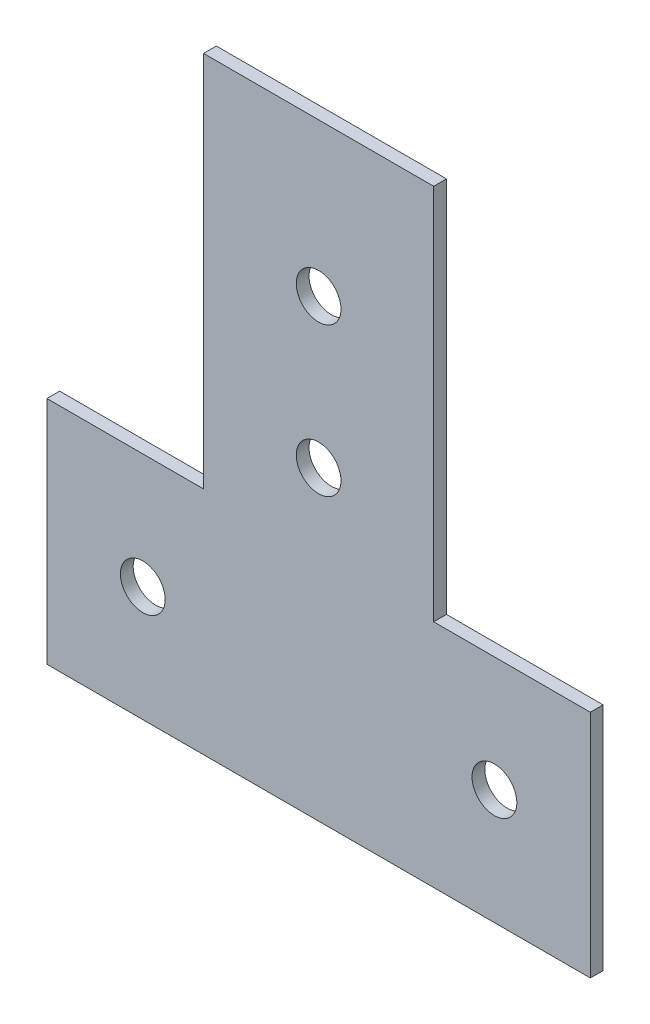
ISO-10303-21;
HEADER;
FILE_DESCRIPTION(('STEP AP214'),'2;1');
FILE_NAME('part.step','',(''),(''),'','','');
FILE_SCHEMA(('AUTOMOTIVE_DESIGN { 1 0 10303 214 1 1 1 1 }'));
ENDSEC;
DATA;
#1=APPLICATION_CONTEXT('core data for automotive mechanical design processes');
#2=APPLICATION_PROTOCOL_DEFINITION('international standard','automotive_design',2000,#1);
#3=PRODUCT_CONTEXT('',#1,'mechanical');
#4=PRODUCT('Part','Part','',(#3));
#5=PRODUCT_RELATED_PRODUCT_CATEGORY('part','',(#4));
#6=PRODUCT_DEFINITION_FORMATION('','',#4);
#7=PRODUCT_DEFINITION_CONTEXT('part definition',#1,'design');
#8=PRODUCT_DEFINITION('design','',#6,#7);
#9=PRODUCT_DEFINITION_SHAPE('','',#8);
#10=(LENGTH_UNIT() NAMED_UNIT(*) SI_UNIT(.MILLI.,.METRE.));
#11=(NAMED_UNIT(*) PLANE_ANGLE_UNIT() SI_UNIT($,.RADIAN.));
#12=(NAMED_UNIT(*) SI_UNIT($,.STERADIAN.) SOLID_ANGLE_UNIT());
#13=UNCERTAINTY_MEASURE_WITH_UNIT(LENGTH_MEASURE(1.E-05),#10,'distance_accuracy_value','');
#14=(GEOMETRIC_REPRESENTATION_CONTEXT(3) GLOBAL_UNCERTAINTY_ASSIGNED_CONTEXT((#13)) GLOBAL_UNIT_ASSIGNED_CONTEXT((#10,
#11,#12)) REPRESENTATION_CONTEXT('',''));
#15=CARTESIAN_POINT('',(0.,0.,0.));
#16=DIRECTION('',(0.,0.,1.));
#17=DIRECTION('',(1.,0.,0.));
#18=AXIS2_PLACEMENT_3D('',#15,#16,#17);
#19=CARTESIAN_POINT('',(18.,18.,2.));
#20=DIRECTION('',(0.,-1.,0.));
#21=DIRECTION('',(0.,0.,-1.));
#22=AXIS2_PLACEMENT_3D('',#19,#20,#21);
#23=PLANE('',#22);
#24=DIRECTION('',(-1.,0.,0.));
#25=VECTOR('',#24,1.);
#26=CARTESIAN_POINT('',(18.,18.,0.));
#27=LINE('',#26,#25);
#28=CARTESIAN_POINT('',(42.5,18.,0.));
#29=VERTEX_POINT('',#28);
#30=CARTESIAN_POINT('',(18.,18.,0.));
#31=VERTEX_POINT('',#30);
#32=EDGE_CURVE('E127',#29,#31,#27,.T.);
#33=ORIENTED_EDGE('',*,*,#32,.T.);
#34=DIRECTION('',(0.,0.,-1.));
#35=VECTOR('',#34,1.);
#36=CARTESIAN_POINT('',(18.,18.,2.));
#37=LINE('',#36,#35);
#38=CARTESIAN_POINT('',(18.,18.,2.));
#39=VERTEX_POINT('',#38);
#40=EDGE_CURVE('E11',#39,#31,#37,.T.);
#41=ORIENTED_EDGE('',*,*,#40,.F.);
#42=DIRECTION('',(-1.,0.,0.));
#43=VECTOR('',#42,1.);
#44=CARTESIAN_POINT('',(18.,18.,2.));
#45=LINE('',#44,#43);
#46=CARTESIAN_POINT('',(42.5,18.,2.));
#47=VERTEX_POINT('',#46);
#48=EDGE_CURVE('E142',#47,#39,#45,.T.);
#49=ORIENTED_EDGE('',*,*,#48,.F.);
#50=DIRECTION('',(0.,0.,-1.));
#51=VECTOR('',#50,1.);
#52=CARTESIAN_POINT('',(42.5,18.,2.));
#53=LINE('',#52,#51);
#54=EDGE_CURVE('E123',#47,#29,#53,.T.);
#55=ORIENTED_EDGE('',*,*,#54,.T.);
#56=EDGE_LOOP('',(#33,#41,#49,#55));
#57=FACE_BOUND('',#56,.T.);
#58=ADVANCED_FACE('F31',(#57),#23,.F.);
#59=CARTESIAN_POINT('',(18.,18.,2.));
#60=DIRECTION('',(-1.,0.,0.));
#61=DIRECTION('',(0.,0.,1.));
#62=AXIS2_PLACEMENT_3D('',#59,#60,#61);
#63=PLANE('',#62);
#64=DIRECTION('',(0.,1.,0.));
#65=VECTOR('',#64,1.);
#66=CARTESIAN_POINT('',(18.,18.,0.));
#67=LINE('',#66,#65);
#68=CARTESIAN_POINT('',(18.,77.,0.));
#69=VERTEX_POINT('',#68);
#70=EDGE_CURVE('E130',#31,#69,#67,.T.);
#71=ORIENTED_EDGE('',*,*,#70,.T.);
#72=DIRECTION('',(0.,0.,-1.));
#73=VECTOR('',#72,1.);
#74=CARTESIAN_POINT('',(18.,77.,2.));
#75=LINE('',#74,#73);
#76=CARTESIAN_POINT('',(18.,77.,2.));
#77=VERTEX_POINT('',#76);
#78=EDGE_CURVE('E39',#77,#69,#75,.T.);
#79=ORIENTED_EDGE('',*,*,#78,.F.);
#80=DIRECTION('',(0.,1.,0.));
#81=VECTOR('',#80,1.);
#82=CARTESIAN_POINT('',(18.,18.,2.));
#83=LINE('',#82,#81);
#84=EDGE_CURVE('E90',#39,#77,#83,.T.);
#85=ORIENTED_EDGE('',*,*,#84,.F.);
#86=ORIENTED_EDGE('',*,*,#40,.T.);
#87=EDGE_LOOP('',(#71,#79,#85,#86));
#88=FACE_BOUND('',#87,.T.);
#89=ADVANCED_FACE('F232',(#88),#63,.F.);
#90=CARTESIAN_POINT('',(-18.,77.,2.));
#91=DIRECTION('',(0.,-1.,0.));
#92=DIRECTION('',(0.,0.,-1.));
#93=AXIS2_PLACEMENT_3D('',#90,#91,#92);
#94=PLANE('',#93);
#95=DIRECTION('',(-1.,0.,0.));
#96=VECTOR('',#95,1.);
#97=CARTESIAN_POINT('',(-18.,77.,0.));
#98=LINE('',#97,#96);
#99=CARTESIAN_POINT('',(-18.,77.,0.));
#100=VERTEX_POINT('',#99);
#101=EDGE_CURVE('E133',#69,#100,#98,.T.);
#102=ORIENTED_EDGE('',*,*,#101,.T.);
#103=DIRECTION('',(0.,0.,-1.));
#104=VECTOR('',#103,1.);
#105=CARTESIAN_POINT('',(-18.,77.,2.));
#106=LINE('',#105,#104);
#107=CARTESIAN_POINT('',(-18.,77.,2.));
#108=VERTEX_POINT('',#107);
#109=EDGE_CURVE('E149',#108,#100,#106,.T.);
#110=ORIENTED_EDGE('',*,*,#109,.F.);
#111=DIRECTION('',(-1.,0.,0.));
#112=VECTOR('',#111,1.);
#113=CARTESIAN_POINT('',(-18.,77.,2.));
#114=LINE('',#113,#112);
#115=EDGE_CURVE('E157',#77,#108,#114,.T.);
#116=ORIENTED_EDGE('',*,*,#115,.F.);
#117=ORIENTED_EDGE('',*,*,#78,.T.);
#118=EDGE_LOOP('',(#102,#110,#116,#117));
#119=FACE_BOUND('',#118,.T.);
#120=ADVANCED_FACE('F155',(#119),#94,.F.);
#121=CARTESIAN_POINT('',(-18.,18.,2.));
#122=DIRECTION('',(1.,0.,0.));
#123=DIRECTION('',(0.,0.,-1.));
#124=AXIS2_PLACEMENT_3D('',#121,#122,#123);
#125=PLANE('',#124);
#126=DIRECTION('',(0.,-1.,0.));
#127=VECTOR('',#126,1.);
#128=CARTESIAN_POINT('',(-18.,18.,0.));
#129=LINE('',#128,#127);
#130=CARTESIAN_POINT('',(-18.,18.,0.));
#131=VERTEX_POINT('',#130);
#132=EDGE_CURVE('E135',#100,#131,#129,.T.);
#133=ORIENTED_EDGE('',*,*,#132,.T.);
#134=DIRECTION('',(0.,0.,-1.));
#135=VECTOR('',#134,1.);
#136=CARTESIAN_POINT('',(-18.,18.,2.));
#137=LINE('',#136,#135);
#138=CARTESIAN_POINT('',(-18.,18.,2.));
#139=VERTEX_POINT('',#138);
#140=EDGE_CURVE('E146',#139,#131,#137,.T.);
#141=ORIENTED_EDGE('',*,*,#140,.F.);
#142=DIRECTION('',(0.,-1.,0.));
#143=VECTOR('',#142,1.);
#144=CARTESIAN_POINT('',(-18.,18.,2.));
#145=LINE('',#144,#143);
#146=EDGE_CURVE('E169',#108,#139,#145,.T.);
#147=ORIENTED_EDGE('',*,*,#146,.F.);
#148=ORIENTED_EDGE('',*,*,#109,.T.);
#149=EDGE_LOOP('',(#133,#141,#147,#148));
#150=FACE_BOUND('',#149,.T.);
#151=ADVANCED_FACE('F165',(#150),#125,.F.);
#152=CARTESIAN_POINT('',(-42.5,18.,2.));
#153=DIRECTION('',(0.,-1.,0.));
#154=DIRECTION('',(0.,0.,-1.));
#155=AXIS2_PLACEMENT_3D('',#152,#153,#154);
#156=PLANE('',#155);
#157=DIRECTION('',(-1.,0.,0.));
#158=VECTOR('',#157,1.);
#159=CARTESIAN_POINT('',(-42.5,18.,0.));
#160=LINE('',#159,#158);
#161=CARTESIAN_POINT('',(-42.5,18.,0.));
#162=VERTEX_POINT('',#161);
#163=EDGE_CURVE('E137',#131,#162,#160,.T.);
#164=ORIENTED_EDGE('',*,*,#163,.T.);
#165=DIRECTION('',(0.,0.,-1.));
#166=VECTOR('',#165,1.);
#167=CARTESIAN_POINT('',(-42.5,18.,2.));
#168=LINE('',#167,#166);
#169=CARTESIAN_POINT('',(-42.5,18.,2.));
#170=VERTEX_POINT('',#169);
#171=EDGE_CURVE('E118',#170,#162,#168,.T.);
#172=ORIENTED_EDGE('',*,*,#171,.F.);
#173=DIRECTION('',(-1.,0.,0.));
#174=VECTOR('',#173,1.);
#175=CARTESIAN_POINT('',(-42.5,18.,2.));
#176=LINE('',#175,#174);
#177=EDGE_CURVE('E109',#139,#170,#176,.T.);
#178=ORIENTED_EDGE('',*,*,#177,.F.);
#179=ORIENTED_EDGE('',*,*,#140,.T.);
#180=EDGE_LOOP('',(#164,#172,#178,#179));
#181=FACE_BOUND('',#180,.T.);
#182=ADVANCED_FACE('F168',(#181),#156,.F.);
#183=CARTESIAN_POINT('',(-42.5,-18.,2.));
#184=DIRECTION('',(1.,0.,0.));
#185=DIRECTION('',(0.,0.,-1.));
#186=AXIS2_PLACEMENT_3D('',#183,#184,#185);
#187=PLANE('',#186);
#188=DIRECTION('',(0.,-1.,0.));
#189=VECTOR('',#188,1.);
#190=CARTESIAN_POINT('',(-42.5,-18.,0.));
#191=LINE('',#190,#189);
#192=CARTESIAN_POINT('',(-42.5,-18.,0.));
#193=VERTEX_POINT('',#192);
#194=EDGE_CURVE('E117',#162,#193,#191,.T.);
#195=ORIENTED_EDGE('',*,*,#194,.T.);
#196=DIRECTION('',(0.,0.,-1.));
#197=VECTOR('',#196,1.);
#198=CARTESIAN_POINT('',(-42.5,-18.,2.));
#199=LINE('',#198,#197);
#200=CARTESIAN_POINT('',(-42.5,-18.,2.));
#201=VERTEX_POINT('',#200);
#202=EDGE_CURVE('E114',#201,#193,#199,.T.);
#203=ORIENTED_EDGE('',*,*,#202,.F.);
#204=DIRECTION('',(0.,-1.,0.));
#205=VECTOR('',#204,1.);
#206=CARTESIAN_POINT('',(-42.5,-18.,2.));
#207=LINE('',#206,#205);
#208=EDGE_CURVE('E103',#170,#201,#207,.T.);
#209=ORIENTED_EDGE('',*,*,#208,.F.);
#210=ORIENTED_EDGE('',*,*,#171,.T.);
#211=EDGE_LOOP('',(#195,#203,#209,#210));
#212=FACE_BOUND('',#211,.T.);
#213=ADVANCED_FACE('F115',(#212),#187,.F.);
#214=CARTESIAN_POINT('',(-42.5,-18.,2.));
#215=DIRECTION('',(0.,1.,0.));
#216=DIRECTION('',(0.,0.,1.));
#217=AXIS2_PLACEMENT_3D('',#214,#215,#216);
#218=PLANE('',#217);
#219=DIRECTION('',(1.,0.,0.));
#220=VECTOR('',#219,1.);
#221=CARTESIAN_POINT('',(-42.5,-18.,0.));
#222=LINE('',#221,#220);
#223=CARTESIAN_POINT('',(42.5,-18.,0.));
#224=VERTEX_POINT('',#223);
#225=EDGE_CURVE('E76',#193,#224,#222,.T.);
#226=ORIENTED_EDGE('',*,*,#225,.T.);
#227=DIRECTION('',(0.,0.,-1.));
#228=VECTOR('',#227,1.);
#229=CARTESIAN_POINT('',(42.5,-18.,2.));
#230=LINE('',#229,#228);
#231=CARTESIAN_POINT('',(42.5,-18.,2.));
#232=VERTEX_POINT('',#231);
#233=EDGE_CURVE('E119',#232,#224,#230,.T.);
#234=ORIENTED_EDGE('',*,*,#233,.F.);
#235=DIRECTION('',(1.,0.,0.));
#236=VECTOR('',#235,1.);
#237=CARTESIAN_POINT('',(-42.5,-18.,2.));
#238=LINE('',#237,#236);
#239=EDGE_CURVE('E107',#201,#232,#238,.T.);
#240=ORIENTED_EDGE('',*,*,#239,.F.);
#241=ORIENTED_EDGE('',*,*,#202,.T.);
#242=EDGE_LOOP('',(#226,#234,#240,#241));
#243=FACE_BOUND('',#242,.T.);
#244=ADVANCED_FACE('F121',(#243),#218,.F.);
#245=CARTESIAN_POINT('',(42.5,-18.,2.));
#246=DIRECTION('',(-1.,0.,0.));
#247=DIRECTION('',(0.,0.,1.));
#248=AXIS2_PLACEMENT_3D('',#245,#246,#247);
#249=PLANE('',#248);
#250=DIRECTION('',(0.,1.,0.));
#251=VECTOR('',#250,1.);
#252=CARTESIAN_POINT('',(42.5,-18.,0.));
#253=LINE('',#252,#251);
#254=EDGE_CURVE('E82',#224,#29,#253,.T.);
#255=ORIENTED_EDGE('',*,*,#254,.T.);
#256=ORIENTED_EDGE('',*,*,#54,.F.);
#257=DIRECTION('',(0.,1.,0.));
#258=VECTOR('',#257,1.);
#259=CARTESIAN_POINT('',(42.5,-18.,2.));
#260=LINE('',#259,#258);
#261=EDGE_CURVE('E47',#232,#47,#260,.T.);
#262=ORIENTED_EDGE('',*,*,#261,.F.);
#263=ORIENTED_EDGE('',*,*,#233,.T.);
#264=EDGE_LOOP('',(#255,#256,#262,#263));
#265=FACE_BOUND('',#264,.T.);
#266=ADVANCED_FACE('F210',(#265),#249,.F.);
#267=CARTESIAN_POINT('',(42.5,18.,2.));
#268=DIRECTION('',(0.,0.,1.));
#269=DIRECTION('',(1.,0.,0.));
#270=AXIS2_PLACEMENT_3D('',#267,#268,#269);
#271=PLANE('',#270);
#272=CARTESIAN_POINT('',(27.5,0.,2.));
#273=DIRECTION('',(0.,0.,1.));
#274=DIRECTION('',(-1.,0.,0.));
#275=AXIS2_PLACEMENT_3D('',#272,#273,#274);
#276=CIRCLE('',#275,3.5);
#277=CARTESIAN_POINT('',(24.,0.,2.));
#278=VERTEX_POINT('',#277);
#279=EDGE_CURVE('E193',#278,#278,#276,.T.);
#280=ORIENTED_EDGE('',*,*,#279,.F.);
#281=EDGE_LOOP('',(#280));
#282=FACE_BOUND('',#281,.T.);
#283=CARTESIAN_POINT('',(-27.5,0.,2.));
#284=DIRECTION('',(0.,0.,1.));
#285=DIRECTION('',(1.,0.,0.));
#286=AXIS2_PLACEMENT_3D('',#283,#284,#285);
#287=CIRCLE('',#286,3.5);
#288=CARTESIAN_POINT('',(-24.,0.,2.));
#289=VERTEX_POINT('',#288);
#290=EDGE_CURVE('E187',#289,#289,#287,.T.);
#291=ORIENTED_EDGE('',*,*,#290,.F.);
#292=EDGE_LOOP('',(#291));
#293=FACE_BOUND('',#292,.T.);
#294=CARTESIAN_POINT('',(0.,29.8521829483193,2.));
#295=DIRECTION('',(0.,0.,1.));
#296=DIRECTION('',(1.,0.,0.));
#297=AXIS2_PLACEMENT_3D('',#294,#295,#296);
#298=CIRCLE('',#297,3.5);
#299=CARTESIAN_POINT('',(3.5,29.8521829483193,2.));
#300=VERTEX_POINT('',#299);
#301=EDGE_CURVE('E181',#300,#300,#298,.T.);
#302=ORIENTED_EDGE('',*,*,#301,.F.);
#303=EDGE_LOOP('',(#302));
#304=FACE_BOUND('',#303,.T.);
#305=CARTESIAN_POINT('',(0.,53.0962575373912,2.));
#306=DIRECTION('',(0.,0.,1.));
#307=DIRECTION('',(1.,0.,0.));
#308=AXIS2_PLACEMENT_3D('',#305,#306,#307);
#309=CIRCLE('',#308,3.5);
#310=CARTESIAN_POINT('',(3.5,53.0962575373912,2.));
#311=VERTEX_POINT('',#310);
#312=EDGE_CURVE('E175',#311,#311,#309,.T.);
#313=ORIENTED_EDGE('',*,*,#312,.F.);
#314=EDGE_LOOP('',(#313));
#315=FACE_BOUND('',#314,.T.);
#316=ORIENTED_EDGE('',*,*,#48,.T.);
#317=ORIENTED_EDGE('',*,*,#84,.T.);
#318=ORIENTED_EDGE('',*,*,#115,.T.);
#319=ORIENTED_EDGE('',*,*,#146,.T.);
#320=ORIENTED_EDGE('',*,*,#177,.T.);
#321=ORIENTED_EDGE('',*,*,#208,.T.);
#322=ORIENTED_EDGE('',*,*,#239,.T.);
#323=ORIENTED_EDGE('',*,*,#261,.T.);
#324=EDGE_LOOP('',(#316,#317,#318,#319,#320,#321,#322,#323));
#325=FACE_BOUND('',#324,.T.);
#326=ADVANCED_FACE('F105',(#282,#293,#304,#315,#325),#271,.T.);
#327=CARTESIAN_POINT('',(42.5,18.,0.));
#328=DIRECTION('',(0.,0.,1.));
#329=DIRECTION('',(1.,0.,0.));
#330=AXIS2_PLACEMENT_3D('',#327,#328,#329);
#331=PLANE('',#330);
#332=CARTESIAN_POINT('',(27.5,0.,0.));
#333=DIRECTION('',(0.,0.,1.));
#334=DIRECTION('',(-1.,0.,0.));
#335=AXIS2_PLACEMENT_3D('',#332,#333,#334);
#336=CIRCLE('',#335,3.5);
#337=CARTESIAN_POINT('',(24.,0.,0.));
#338=VERTEX_POINT('',#337);
#339=EDGE_CURVE('E190',#338,#338,#336,.T.);
#340=ORIENTED_EDGE('',*,*,#339,.T.);
#341=EDGE_LOOP('',(#340));
#342=FACE_BOUND('',#341,.T.);
#343=CARTESIAN_POINT('',(-27.5,0.,0.));
#344=DIRECTION('',(0.,0.,1.));
#345=DIRECTION('',(1.,0.,0.));
#346=AXIS2_PLACEMENT_3D('',#343,#344,#345);
#347=CIRCLE('',#346,3.5);
#348=CARTESIAN_POINT('',(-24.,0.,0.));
#349=VERTEX_POINT('',#348);
#350=EDGE_CURVE('E184',#349,#349,#347,.T.);
#351=ORIENTED_EDGE('',*,*,#350,.T.);
#352=EDGE_LOOP('',(#351));
#353=FACE_BOUND('',#352,.T.);
#354=CARTESIAN_POINT('',(0.,29.8521829483193,0.));
#355=DIRECTION('',(0.,0.,1.));
#356=DIRECTION('',(1.,0.,0.));
#357=AXIS2_PLACEMENT_3D('',#354,#355,#356);
#358=CIRCLE('',#357,3.5);
#359=CARTESIAN_POINT('',(3.5,29.8521829483193,0.));
#360=VERTEX_POINT('',#359);
#361=EDGE_CURVE('E178',#360,#360,#358,.T.);
#362=ORIENTED_EDGE('',*,*,#361,.T.);
#363=EDGE_LOOP('',(#362));
#364=FACE_BOUND('',#363,.T.);
#365=CARTESIAN_POINT('',(0.,53.0962575373912,0.));
#366=DIRECTION('',(0.,0.,1.));
#367=DIRECTION('',(1.,0.,0.));
#368=AXIS2_PLACEMENT_3D('',#365,#366,#367);
#369=CIRCLE('',#368,3.5);
#370=CARTESIAN_POINT('',(3.5,53.0962575373912,0.));
#371=VERTEX_POINT('',#370);
#372=EDGE_CURVE('E131',#371,#371,#369,.T.);
#373=ORIENTED_EDGE('',*,*,#372,.T.);
#374=EDGE_LOOP('',(#373));
#375=FACE_BOUND('',#374,.T.);
#376=ORIENTED_EDGE('',*,*,#32,.F.);
#377=ORIENTED_EDGE('',*,*,#254,.F.);
#378=ORIENTED_EDGE('',*,*,#225,.F.);
#379=ORIENTED_EDGE('',*,*,#194,.F.);
#380=ORIENTED_EDGE('',*,*,#163,.F.);
#381=ORIENTED_EDGE('',*,*,#132,.F.);
#382=ORIENTED_EDGE('',*,*,#101,.F.);
#383=ORIENTED_EDGE('',*,*,#70,.F.);
#384=EDGE_LOOP('',(#376,#377,#378,#379,#380,#381,#382,#383));
#385=FACE_BOUND('',#384,.T.);
#386=ADVANCED_FACE('F161',(#342,#353,#364,#375,#385),#331,.F.);
#387=CARTESIAN_POINT('',(0.,53.0962575373912,0.));
#388=DIRECTION('',(0.,0.,1.));
#389=DIRECTION('',(1.,0.,0.));
#390=AXIS2_PLACEMENT_3D('',#387,#388,#389);
#391=CYLINDRICAL_SURFACE('',#390,3.5);
#392=ORIENTED_EDGE('',*,*,#372,.F.);
#393=EDGE_LOOP('',(#392));
#394=FACE_BOUND('',#393,.T.);
#395=ORIENTED_EDGE('',*,*,#312,.T.);
#396=EDGE_LOOP('',(#395));
#397=FACE_BOUND('',#396,.T.);
#398=ADVANCED_FACE('F218',(#394,#397),#391,.F.);
#399=CARTESIAN_POINT('',(0.,29.8521829483193,0.));
#400=DIRECTION('',(0.,0.,1.));
#401=DIRECTION('',(1.,0.,0.));
#402=AXIS2_PLACEMENT_3D('',#399,#400,#401);
#403=CYLINDRICAL_SURFACE('',#402,3.5);
#404=ORIENTED_EDGE('',*,*,#361,.F.);
#405=EDGE_LOOP('',(#404));
#406=FACE_BOUND('',#405,.T.);
#407=ORIENTED_EDGE('',*,*,#301,.T.);
#408=EDGE_LOOP('',(#407));
#409=FACE_BOUND('',#408,.T.);
#410=ADVANCED_FACE('F220',(#406,#409),#403,.F.);
#411=CARTESIAN_POINT('',(-27.5,0.,0.));
#412=DIRECTION('',(0.,0.,1.));
#413=DIRECTION('',(1.,0.,0.));
#414=AXIS2_PLACEMENT_3D('',#411,#412,#413);
#415=CYLINDRICAL_SURFACE('',#414,3.5);
#416=ORIENTED_EDGE('',*,*,#350,.F.);
#417=EDGE_LOOP('',(#416));
#418=FACE_BOUND('',#417,.T.);
#419=ORIENTED_EDGE('',*,*,#290,.T.);
#420=EDGE_LOOP('',(#419));
#421=FACE_BOUND('',#420,.T.);
#422=ADVANCED_FACE('F204',(#418,#421),#415,.F.);
#423=CARTESIAN_POINT('',(27.5,0.,0.));
#424=DIRECTION('',(0.,0.,1.));
#425=DIRECTION('',(1.,0.,0.));
#426=AXIS2_PLACEMENT_3D('',#423,#424,#425);
#427=CYLINDRICAL_SURFACE('',#426,3.5);
#428=ORIENTED_EDGE('',*,*,#339,.F.);
#429=EDGE_LOOP('',(#428));
#430=FACE_BOUND('',#429,.T.);
#431=ORIENTED_EDGE('',*,*,#279,.T.);
#432=EDGE_LOOP('',(#431));
#433=FACE_BOUND('',#432,.T.);
#434=ADVANCED_FACE('F201',(#430,#433),#427,.F.);
#435=CLOSED_SHELL('',(#58,#89,#120,#151,#182,#213,#244,#266,#326,#386,#398,#410,#422,#434));
#436=MANIFOLD_SOLID_BREP('B2',#435);
#437=ADVANCED_BREP_SHAPE_REPRESENTATION('',(#18,#436),#14);
#438=SHAPE_DEFINITION_REPRESENTATION(#9,#437);
ENDSEC;
END-ISO-10303-21;
